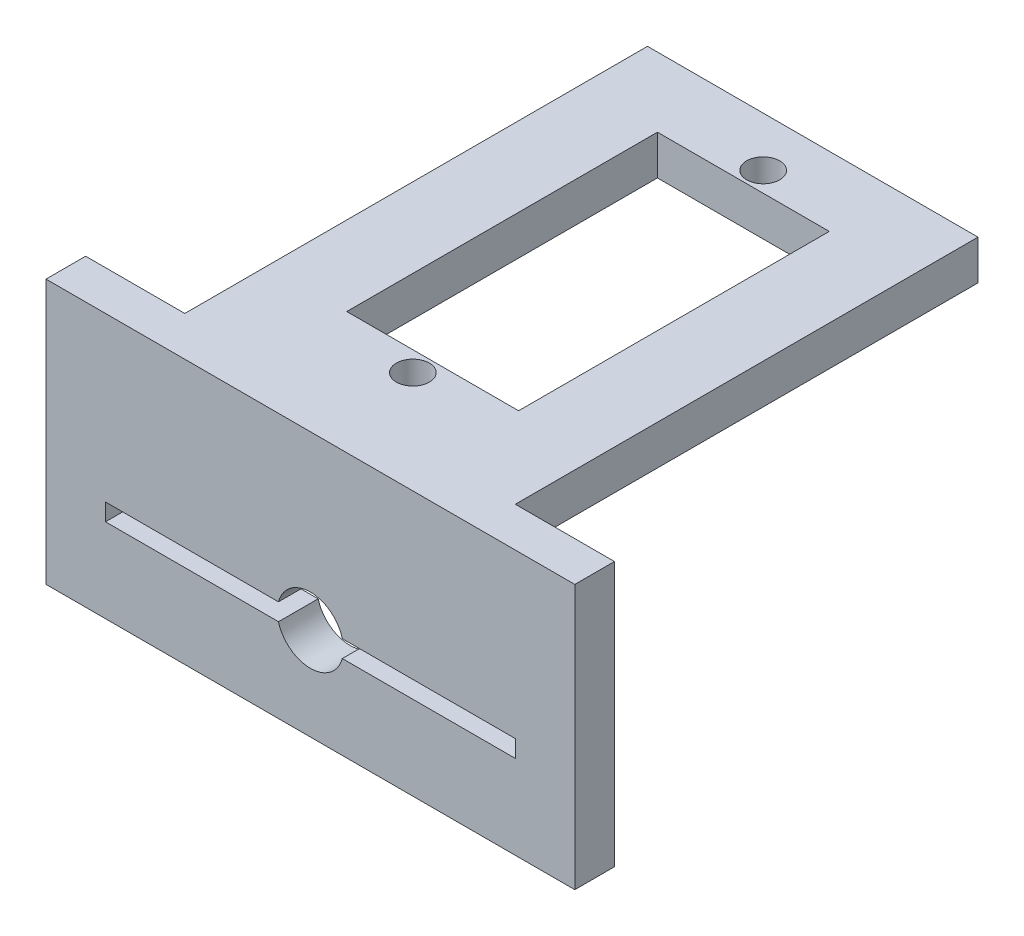
ISO-10303-21;
HEADER;
FILE_DESCRIPTION(('STEP AP214'),'2;1');
FILE_NAME('part.step','',(''),(''),'','','');
FILE_SCHEMA(('AUTOMOTIVE_DESIGN { 1 0 10303 214 1 1 1 1 }'));
ENDSEC;
DATA;
#1=APPLICATION_CONTEXT('core data for automotive mechanical design processes');
#2=APPLICATION_PROTOCOL_DEFINITION('international standard','automotive_design',2000,#1);
#3=PRODUCT_CONTEXT('',#1,'mechanical');
#4=PRODUCT('Part','Part','',(#3));
#5=PRODUCT_RELATED_PRODUCT_CATEGORY('part','',(#4));
#6=PRODUCT_DEFINITION_FORMATION('','',#4);
#7=PRODUCT_DEFINITION_CONTEXT('part definition',#1,'design');
#8=PRODUCT_DEFINITION('design','',#6,#7);
#9=PRODUCT_DEFINITION_SHAPE('','',#8);
#10=(LENGTH_UNIT() NAMED_UNIT(*) SI_UNIT(.MILLI.,.METRE.));
#11=(NAMED_UNIT(*) PLANE_ANGLE_UNIT() SI_UNIT($,.RADIAN.));
#12=(NAMED_UNIT(*) SI_UNIT($,.STERADIAN.) SOLID_ANGLE_UNIT());
#13=UNCERTAINTY_MEASURE_WITH_UNIT(LENGTH_MEASURE(1.E-05),#10,'distance_accuracy_value','');
#14=(GEOMETRIC_REPRESENTATION_CONTEXT(3) GLOBAL_UNCERTAINTY_ASSIGNED_CONTEXT((#13)) GLOBAL_UNIT_ASSIGNED_CONTEXT((#10,
#11,#12)) REPRESENTATION_CONTEXT('',''));
#15=CARTESIAN_POINT('',(0.,0.,0.));
#16=DIRECTION('',(0.,0.,1.));
#17=DIRECTION('',(1.,0.,0.));
#18=AXIS2_PLACEMENT_3D('',#15,#16,#17);
#19=CARTESIAN_POINT('',(0.,0.,-2.));
#20=DIRECTION('',(0.,0.,1.));
#21=DIRECTION('',(-1.,0.,0.));
#22=AXIS2_PLACEMENT_3D('',#19,#20,#21);
#23=PLANE('',#22);
#24=DIRECTION('',(1.,0.,0.));
#25=VECTOR('',#24,1.);
#26=CARTESIAN_POINT('',(15.5,-4.34999999999999,-2.));
#27=LINE('',#26,#25);
#28=CARTESIAN_POINT('',(2.41402154091466,-4.34999999999999,-2.));
#29=VERTEX_POINT('',#28);
#30=CARTESIAN_POINT('',(15.5,-4.34999999999999,-2.));
#31=VERTEX_POINT('',#30);
#32=EDGE_CURVE('E227',#29,#31,#27,.T.);
#33=ORIENTED_EDGE('',*,*,#32,.F.);
#34=CARTESIAN_POINT('',(0.,-4.99999999999999,-2.));
#35=DIRECTION('',(0.,0.,-1.));
#36=DIRECTION('',(-1.,0.,0.));
#37=AXIS2_PLACEMENT_3D('',#34,#35,#36);
#38=CIRCLE('',#37,2.5);
#39=CARTESIAN_POINT('',(-2.41402154091466,-4.34999999999999,-2.));
#40=VERTEX_POINT('',#39);
#41=EDGE_CURVE('E242',#40,#29,#38,.T.);
#42=ORIENTED_EDGE('',*,*,#41,.F.);
#43=DIRECTION('',(1.,0.,0.));
#44=VECTOR('',#43,1.);
#45=CARTESIAN_POINT('',(-2.41402154091466,-4.34999999999999,-2.));
#46=LINE('',#45,#44);
#47=CARTESIAN_POINT('',(-15.5,-4.35,-2.));
#48=VERTEX_POINT('',#47);
#49=EDGE_CURVE('E239',#48,#40,#46,.T.);
#50=ORIENTED_EDGE('',*,*,#49,.F.);
#51=DIRECTION('',(0.,1.,0.));
#52=VECTOR('',#51,1.);
#53=CARTESIAN_POINT('',(-15.5,-4.35,-2.));
#54=LINE('',#53,#52);
#55=CARTESIAN_POINT('',(-15.5,-5.65,-2.));
#56=VERTEX_POINT('',#55);
#57=EDGE_CURVE('E236',#56,#48,#54,.T.);
#58=ORIENTED_EDGE('',*,*,#57,.F.);
#59=DIRECTION('',(-1.,0.,0.));
#60=VECTOR('',#59,1.);
#61=CARTESIAN_POINT('',(-2.41402154091466,-5.64999999999999,-2.));
#62=LINE('',#61,#60);
#63=CARTESIAN_POINT('',(-2.41402154091466,-5.64999999999999,-2.));
#64=VERTEX_POINT('',#63);
#65=EDGE_CURVE('E233',#64,#56,#62,.T.);
#66=ORIENTED_EDGE('',*,*,#65,.F.);
#67=CARTESIAN_POINT('',(0.,-4.99999999999999,-2.));
#68=DIRECTION('',(0.,0.,-1.));
#69=DIRECTION('',(-1.,0.,0.));
#70=AXIS2_PLACEMENT_3D('',#67,#68,#69);
#71=CIRCLE('',#70,2.5);
#72=CARTESIAN_POINT('',(2.41402154091466,-5.64999999999999,-2.));
#73=VERTEX_POINT('',#72);
#74=EDGE_CURVE('E230',#73,#64,#71,.T.);
#75=ORIENTED_EDGE('',*,*,#74,.F.);
#76=DIRECTION('',(-1.,0.,0.));
#77=VECTOR('',#76,1.);
#78=CARTESIAN_POINT('',(15.5,-5.64999999999999,-2.));
#79=LINE('',#78,#77);
#80=CARTESIAN_POINT('',(15.5,-5.64999999999999,-2.));
#81=VERTEX_POINT('',#80);
#82=EDGE_CURVE('E226',#81,#73,#79,.T.);
#83=ORIENTED_EDGE('',*,*,#82,.F.);
#84=DIRECTION('',(0.,-1.,0.));
#85=VECTOR('',#84,1.);
#86=CARTESIAN_POINT('',(15.5,-4.34999999999999,-2.));
#87=LINE('',#86,#85);
#88=EDGE_CURVE('E223',#31,#81,#87,.T.);
#89=ORIENTED_EDGE('',*,*,#88,.F.);
#90=EDGE_LOOP('',(#33,#42,#50,#58,#66,#75,#83,#89));
#91=FACE_BOUND('',#90,.T.);
#92=DIRECTION('',(0.,-1.,0.));
#93=VECTOR('',#92,1.);
#94=CARTESIAN_POINT('',(-12.5,0.,-2.));
#95=LINE('',#94,#93);
#96=CARTESIAN_POINT('',(-12.5,8.00000000000001,-2.));
#97=VERTEX_POINT('',#96);
#98=CARTESIAN_POINT('',(-12.5,5.00000000000001,-2.));
#99=VERTEX_POINT('',#98);
#100=EDGE_CURVE('E11',#97,#99,#95,.T.);
#101=ORIENTED_EDGE('',*,*,#100,.T.);
#102=DIRECTION('',(1.,0.,0.));
#103=VECTOR('',#102,1.);
#104=CARTESIAN_POINT('',(0.,5.00000000000001,-2.));
#105=LINE('',#104,#103);
#106=CARTESIAN_POINT('',(12.5,5.00000000000001,-2.));
#107=VERTEX_POINT('',#106);
#108=EDGE_CURVE('E182',#99,#107,#105,.T.);
#109=ORIENTED_EDGE('',*,*,#108,.T.);
#110=DIRECTION('',(0.,-1.,0.));
#111=VECTOR('',#110,1.);
#112=CARTESIAN_POINT('',(12.5,0.,-2.));
#113=LINE('',#112,#111);
#114=CARTESIAN_POINT('',(12.5,8.00000000000001,-2.));
#115=VERTEX_POINT('',#114);
#116=EDGE_CURVE('E43',#115,#107,#113,.T.);
#117=ORIENTED_EDGE('',*,*,#116,.F.);
#118=DIRECTION('',(-1.,0.,0.));
#119=VECTOR('',#118,1.);
#120=CARTESIAN_POINT('',(-20.,8.00000000000001,-2.));
#121=LINE('',#120,#119);
#122=CARTESIAN_POINT('',(20.,8.00000000000001,-2.));
#123=VERTEX_POINT('',#122);
#124=EDGE_CURVE('E272',#123,#115,#121,.T.);
#125=ORIENTED_EDGE('',*,*,#124,.F.);
#126=DIRECTION('',(0.,1.,0.));
#127=VECTOR('',#126,1.);
#128=CARTESIAN_POINT('',(20.,-12.,-2.));
#129=LINE('',#128,#127);
#130=CARTESIAN_POINT('',(20.,-12.,-2.));
#131=VERTEX_POINT('',#130);
#132=EDGE_CURVE('E268',#131,#123,#129,.T.);
#133=ORIENTED_EDGE('',*,*,#132,.F.);
#134=DIRECTION('',(1.,0.,0.));
#135=VECTOR('',#134,1.);
#136=CARTESIAN_POINT('',(-20.,-12.,-2.));
#137=LINE('',#136,#135);
#138=CARTESIAN_POINT('',(-20.,-12.,-2.));
#139=VERTEX_POINT('',#138);
#140=EDGE_CURVE('E265',#139,#131,#137,.T.);
#141=ORIENTED_EDGE('',*,*,#140,.F.);
#142=DIRECTION('',(0.,-1.,0.));
#143=VECTOR('',#142,1.);
#144=CARTESIAN_POINT('',(-20.,-12.,-2.));
#145=LINE('',#144,#143);
#146=CARTESIAN_POINT('',(-20.,8.00000000000001,-2.));
#147=VERTEX_POINT('',#146);
#148=EDGE_CURVE('E245',#147,#139,#145,.T.);
#149=ORIENTED_EDGE('',*,*,#148,.F.);
#150=EDGE_CURVE('E271',#97,#147,#121,.T.);
#151=ORIENTED_EDGE('',*,*,#150,.F.);
#152=EDGE_LOOP('',(#101,#109,#117,#125,#133,#141,#149,#151));
#153=FACE_BOUND('',#152,.T.);
#154=ADVANCED_FACE('F35',(#91,#153),#23,.F.);
#155=CARTESIAN_POINT('',(0.,-12.,1.));
#156=DIRECTION('',(0.,-1.,0.));
#157=DIRECTION('',(1.,0.,0.));
#158=AXIS2_PLACEMENT_3D('',#155,#156,#157);
#159=PLANE('',#158);
#160=DIRECTION('',(0.,0.,-1.));
#161=VECTOR('',#160,1.);
#162=CARTESIAN_POINT('',(20.,-12.,1.));
#163=LINE('',#162,#161);
#164=CARTESIAN_POINT('',(20.,-12.,1.));
#165=VERTEX_POINT('',#164);
#166=EDGE_CURVE('E286',#165,#131,#163,.T.);
#167=ORIENTED_EDGE('',*,*,#166,.F.);
#168=DIRECTION('',(1.,0.,0.));
#169=VECTOR('',#168,1.);
#170=CARTESIAN_POINT('',(0.,-12.,1.));
#171=LINE('',#170,#169);
#172=CARTESIAN_POINT('',(-20.,-12.,1.));
#173=VERTEX_POINT('',#172);
#174=EDGE_CURVE('E275',#173,#165,#171,.T.);
#175=ORIENTED_EDGE('',*,*,#174,.F.);
#176=DIRECTION('',(0.,0.,-1.));
#177=VECTOR('',#176,1.);
#178=CARTESIAN_POINT('',(-20.,-12.,1.));
#179=LINE('',#178,#177);
#180=EDGE_CURVE('E287',#173,#139,#179,.T.);
#181=ORIENTED_EDGE('',*,*,#180,.T.);
#182=ORIENTED_EDGE('',*,*,#140,.T.);
#183=EDGE_LOOP('',(#167,#175,#181,#182));
#184=FACE_BOUND('',#183,.T.);
#185=ADVANCED_FACE('F37',(#184),#159,.T.);
#186=CARTESIAN_POINT('',(-20.,0.,1.));
#187=DIRECTION('',(1.,0.,0.));
#188=DIRECTION('',(0.,0.,1.));
#189=AXIS2_PLACEMENT_3D('',#186,#187,#188);
#190=PLANE('',#189);
#191=ORIENTED_EDGE('',*,*,#180,.F.);
#192=DIRECTION('',(0.,1.,0.));
#193=VECTOR('',#192,1.);
#194=CARTESIAN_POINT('',(-20.,0.,1.));
#195=LINE('',#194,#193);
#196=CARTESIAN_POINT('',(-20.,8.00000000000001,1.));
#197=VERTEX_POINT('',#196);
#198=EDGE_CURVE('E283',#173,#197,#195,.T.);
#199=ORIENTED_EDGE('',*,*,#198,.T.);
#200=DIRECTION('',(0.,0.,-1.));
#201=VECTOR('',#200,1.);
#202=CARTESIAN_POINT('',(-20.,8.00000000000001,1.));
#203=LINE('',#202,#201);
#204=EDGE_CURVE('E289',#197,#147,#203,.T.);
#205=ORIENTED_EDGE('',*,*,#204,.T.);
#206=ORIENTED_EDGE('',*,*,#148,.T.);
#207=EDGE_LOOP('',(#191,#199,#205,#206));
#208=FACE_BOUND('',#207,.T.);
#209=ADVANCED_FACE('F386',(#208),#190,.F.);
#210=CARTESIAN_POINT('',(0.,8.00000000000001,1.));
#211=DIRECTION('',(0.,-1.,0.));
#212=DIRECTION('',(0.,0.,1.));
#213=AXIS2_PLACEMENT_3D('',#210,#211,#212);
#214=PLANE('',#213);
#215=DIRECTION('',(0.,0.,-1.));
#216=VECTOR('',#215,1.);
#217=CARTESIAN_POINT('',(20.,8.00000000000001,1.));
#218=LINE('',#217,#216);
#219=CARTESIAN_POINT('',(20.,8.00000000000001,1.));
#220=VERTEX_POINT('',#219);
#221=EDGE_CURVE('E291',#220,#123,#218,.T.);
#222=ORIENTED_EDGE('',*,*,#221,.T.);
#223=ORIENTED_EDGE('',*,*,#124,.T.);
#224=DIRECTION('',(0.,0.,1.));
#225=VECTOR('',#224,1.);
#226=CARTESIAN_POINT('',(12.5,8.00000000000001,0.));
#227=LINE('',#226,#225);
#228=CARTESIAN_POINT('',(12.5,8.00000000000001,-37.));
#229=VERTEX_POINT('',#228);
#230=EDGE_CURVE('E298',#229,#115,#227,.T.);
#231=ORIENTED_EDGE('',*,*,#230,.F.);
#232=DIRECTION('',(-1.,0.,0.));
#233=VECTOR('',#232,1.);
#234=CARTESIAN_POINT('',(0.,8.00000000000001,-37.));
#235=LINE('',#234,#233);
#236=CARTESIAN_POINT('',(-12.5,8.00000000000001,-37.));
#237=VERTEX_POINT('',#236);
#238=EDGE_CURVE('E309',#229,#237,#235,.T.);
#239=ORIENTED_EDGE('',*,*,#238,.T.);
#240=DIRECTION('',(0.,0.,1.));
#241=VECTOR('',#240,1.);
#242=CARTESIAN_POINT('',(-12.5,8.00000000000001,0.));
#243=LINE('',#242,#241);
#244=EDGE_CURVE('E186',#237,#97,#243,.T.);
#245=ORIENTED_EDGE('',*,*,#244,.T.);
#246=ORIENTED_EDGE('',*,*,#150,.T.);
#247=ORIENTED_EDGE('',*,*,#204,.F.);
#248=DIRECTION('',(1.,0.,0.));
#249=VECTOR('',#248,1.);
#250=CARTESIAN_POINT('',(0.,8.00000000000001,1.));
#251=LINE('',#250,#249);
#252=EDGE_CURVE('E280',#197,#220,#251,.T.);
#253=ORIENTED_EDGE('',*,*,#252,.T.);
#254=EDGE_LOOP('',(#222,#223,#231,#239,#245,#246,#247,#253));
#255=FACE_BOUND('',#254,.T.);
#256=DIRECTION('',(-1.,0.,0.));
#257=VECTOR('',#256,1.);
#258=CARTESIAN_POINT('',(0.,8.00000000000001,-31.75));
#259=LINE('',#258,#257);
#260=CARTESIAN_POINT('',(6.5,8.00000000000001,-31.75));
#261=VERTEX_POINT('',#260);
#262=CARTESIAN_POINT('',(-6.5,8.00000000000001,-31.75));
#263=VERTEX_POINT('',#262);
#264=EDGE_CURVE('E321',#261,#263,#259,.T.);
#265=ORIENTED_EDGE('',*,*,#264,.F.);
#266=DIRECTION('',(0.,0.,1.));
#267=VECTOR('',#266,1.);
#268=CARTESIAN_POINT('',(6.5,8.00000000000001,0.));
#269=LINE('',#268,#267);
#270=CARTESIAN_POINT('',(6.5,8.00000000000001,-8.25000000000001));
#271=VERTEX_POINT('',#270);
#272=EDGE_CURVE('E183',#261,#271,#269,.T.);
#273=ORIENTED_EDGE('',*,*,#272,.T.);
#274=DIRECTION('',(-1.,0.,0.));
#275=VECTOR('',#274,1.);
#276=CARTESIAN_POINT('',(0.,8.00000000000001,-8.25000000000001));
#277=LINE('',#276,#275);
#278=CARTESIAN_POINT('',(-6.5,8.00000000000001,-8.25000000000001));
#279=VERTEX_POINT('',#278);
#280=EDGE_CURVE('E327',#271,#279,#277,.T.);
#281=ORIENTED_EDGE('',*,*,#280,.T.);
#282=DIRECTION('',(0.,0.,1.));
#283=VECTOR('',#282,1.);
#284=CARTESIAN_POINT('',(-6.5,8.00000000000001,0.));
#285=LINE('',#284,#283);
#286=EDGE_CURVE('E324',#263,#279,#285,.T.);
#287=ORIENTED_EDGE('',*,*,#286,.F.);
#288=EDGE_LOOP('',(#265,#273,#281,#287));
#289=FACE_BOUND('',#288,.T.);
#290=CARTESIAN_POINT('',(0.,8.00000000000001,-6.75000000000001));
#291=DIRECTION('',(0.,-1.,0.));
#292=DIRECTION('',(-1.,0.,0.));
#293=AXIS2_PLACEMENT_3D('',#290,#291,#292);
#294=CIRCLE('',#293,1.25);
#295=CARTESIAN_POINT('',(-1.25,8.00000000000001,-6.75000000000001));
#296=VERTEX_POINT('',#295);
#297=EDGE_CURVE('E318',#296,#296,#294,.T.);
#298=ORIENTED_EDGE('',*,*,#297,.T.);
#299=EDGE_LOOP('',(#298));
#300=FACE_BOUND('',#299,.T.);
#301=CARTESIAN_POINT('',(0.,8.00000000000001,-33.25));
#302=DIRECTION('',(0.,-1.,0.));
#303=DIRECTION('',(-1.,0.,0.));
#304=AXIS2_PLACEMENT_3D('',#301,#302,#303);
#305=CIRCLE('',#304,1.25);
#306=CARTESIAN_POINT('',(-1.25,8.00000000000001,-33.25));
#307=VERTEX_POINT('',#306);
#308=EDGE_CURVE('E315',#307,#307,#305,.T.);
#309=ORIENTED_EDGE('',*,*,#308,.T.);
#310=EDGE_LOOP('',(#309));
#311=FACE_BOUND('',#310,.T.);
#312=ADVANCED_FACE('F307',(#255,#289,#300,#311),#214,.F.);
#313=CARTESIAN_POINT('',(20.,0.,1.));
#314=DIRECTION('',(1.,0.,0.));
#315=DIRECTION('',(0.,1.,0.));
#316=AXIS2_PLACEMENT_3D('',#313,#314,#315);
#317=PLANE('',#316);
#318=ORIENTED_EDGE('',*,*,#221,.F.);
#319=DIRECTION('',(0.,1.,0.));
#320=VECTOR('',#319,1.);
#321=CARTESIAN_POINT('',(20.,0.,1.));
#322=LINE('',#321,#320);
#323=EDGE_CURVE('E278',#165,#220,#322,.T.);
#324=ORIENTED_EDGE('',*,*,#323,.F.);
#325=ORIENTED_EDGE('',*,*,#166,.T.);
#326=ORIENTED_EDGE('',*,*,#132,.T.);
#327=EDGE_LOOP('',(#318,#324,#325,#326));
#328=FACE_BOUND('',#327,.T.);
#329=ADVANCED_FACE('F385',(#328),#317,.T.);
#330=CARTESIAN_POINT('',(0.,0.,1.));
#331=DIRECTION('',(0.,0.,-1.));
#332=DIRECTION('',(1.,0.,0.));
#333=AXIS2_PLACEMENT_3D('',#330,#331,#332);
#334=PLANE('',#333);
#335=ORIENTED_EDGE('',*,*,#252,.F.);
#336=ORIENTED_EDGE('',*,*,#198,.F.);
#337=ORIENTED_EDGE('',*,*,#174,.T.);
#338=ORIENTED_EDGE('',*,*,#323,.T.);
#339=EDGE_LOOP('',(#335,#336,#337,#338));
#340=FACE_BOUND('',#339,.T.);
#341=DIRECTION('',(1.,0.,0.));
#342=VECTOR('',#341,1.);
#343=CARTESIAN_POINT('',(15.5,-4.34999999999999,1.));
#344=LINE('',#343,#342);
#345=CARTESIAN_POINT('',(2.41402154091466,-4.34999999999999,1.));
#346=VERTEX_POINT('',#345);
#347=CARTESIAN_POINT('',(15.5,-4.34999999999999,1.));
#348=VERTEX_POINT('',#347);
#349=EDGE_CURVE('E213',#346,#348,#344,.T.);
#350=ORIENTED_EDGE('',*,*,#349,.T.);
#351=DIRECTION('',(0.,-1.,0.));
#352=VECTOR('',#351,1.);
#353=CARTESIAN_POINT('',(15.5,-4.34999999999999,1.));
#354=LINE('',#353,#352);
#355=CARTESIAN_POINT('',(15.5,-5.64999999999999,1.));
#356=VERTEX_POINT('',#355);
#357=EDGE_CURVE('E210',#348,#356,#354,.T.);
#358=ORIENTED_EDGE('',*,*,#357,.T.);
#359=DIRECTION('',(-1.,0.,0.));
#360=VECTOR('',#359,1.);
#361=CARTESIAN_POINT('',(15.5,-5.64999999999999,1.));
#362=LINE('',#361,#360);
#363=CARTESIAN_POINT('',(2.41402154091466,-5.64999999999999,1.));
#364=VERTEX_POINT('',#363);
#365=EDGE_CURVE('E207',#356,#364,#362,.T.);
#366=ORIENTED_EDGE('',*,*,#365,.T.);
#367=CARTESIAN_POINT('',(0.,-4.99999999999999,1.));
#368=DIRECTION('',(0.,0.,1.));
#369=DIRECTION('',(1.,0.,0.));
#370=AXIS2_PLACEMENT_3D('',#367,#368,#369);
#371=CIRCLE('',#370,2.5);
#372=CARTESIAN_POINT('',(-2.41402154091466,-5.64999999999999,1.));
#373=VERTEX_POINT('',#372);
#374=EDGE_CURVE('E204',#364,#373,#371,.F.);
#375=ORIENTED_EDGE('',*,*,#374,.T.);
#376=DIRECTION('',(-1.,0.,0.));
#377=VECTOR('',#376,1.);
#378=CARTESIAN_POINT('',(-2.41402154091466,-5.64999999999999,1.));
#379=LINE('',#378,#377);
#380=CARTESIAN_POINT('',(-15.5,-5.65,1.));
#381=VERTEX_POINT('',#380);
#382=EDGE_CURVE('E200',#373,#381,#379,.T.);
#383=ORIENTED_EDGE('',*,*,#382,.T.);
#384=DIRECTION('',(0.,1.,0.));
#385=VECTOR('',#384,1.);
#386=CARTESIAN_POINT('',(-15.5,-4.35,1.));
#387=LINE('',#386,#385);
#388=CARTESIAN_POINT('',(-15.5,-4.35,1.));
#389=VERTEX_POINT('',#388);
#390=EDGE_CURVE('E197',#381,#389,#387,.T.);
#391=ORIENTED_EDGE('',*,*,#390,.T.);
#392=DIRECTION('',(1.,0.,0.));
#393=VECTOR('',#392,1.);
#394=CARTESIAN_POINT('',(-2.41402154091466,-4.34999999999999,1.));
#395=LINE('',#394,#393);
#396=CARTESIAN_POINT('',(-2.41402154091466,-4.34999999999999,1.));
#397=VERTEX_POINT('',#396);
#398=EDGE_CURVE('E219',#389,#397,#395,.T.);
#399=ORIENTED_EDGE('',*,*,#398,.T.);
#400=CARTESIAN_POINT('',(0.,-4.99999999999999,1.));
#401=DIRECTION('',(0.,0.,1.));
#402=DIRECTION('',(1.,0.,0.));
#403=AXIS2_PLACEMENT_3D('',#400,#401,#402);
#404=CIRCLE('',#403,2.5);
#405=EDGE_CURVE('E216',#397,#346,#404,.F.);
#406=ORIENTED_EDGE('',*,*,#405,.T.);
#407=EDGE_LOOP('',(#350,#358,#366,#375,#383,#391,#399,#406));
#408=FACE_BOUND('',#407,.T.);
#409=ADVANCED_FACE('F408',(#340,#408),#334,.F.);
#410=CARTESIAN_POINT('',(15.5,-4.34999999999999,-33.4006369362152));
#411=DIRECTION('',(0.,-1.,0.));
#412=DIRECTION('',(1.,0.,0.));
#413=AXIS2_PLACEMENT_3D('',#410,#411,#412);
#414=PLANE('',#413);
#415=DIRECTION('',(0.,0.,1.));
#416=VECTOR('',#415,1.);
#417=CARTESIAN_POINT('',(2.41402154091466,-4.34999999999999,-33.4006369362152));
#418=LINE('',#417,#416);
#419=EDGE_CURVE('E222',#29,#346,#418,.T.);
#420=ORIENTED_EDGE('',*,*,#419,.F.);
#421=ORIENTED_EDGE('',*,*,#32,.T.);
#422=DIRECTION('',(0.,0.,1.));
#423=VECTOR('',#422,1.);
#424=CARTESIAN_POINT('',(15.5,-4.34999999999999,-33.4006369362152));
#425=LINE('',#424,#423);
#426=EDGE_CURVE('E247',#31,#348,#425,.T.);
#427=ORIENTED_EDGE('',*,*,#426,.T.);
#428=ORIENTED_EDGE('',*,*,#349,.F.);
#429=EDGE_LOOP('',(#420,#421,#427,#428));
#430=FACE_BOUND('',#429,.T.);
#431=ADVANCED_FACE('F411',(#430),#414,.T.);
#432=CARTESIAN_POINT('',(15.5,-4.34999999999999,-33.4006369362152));
#433=DIRECTION('',(-1.,0.,0.));
#434=DIRECTION('',(0.,0.,-1.));
#435=AXIS2_PLACEMENT_3D('',#432,#433,#434);
#436=PLANE('',#435);
#437=ORIENTED_EDGE('',*,*,#426,.F.);
#438=ORIENTED_EDGE('',*,*,#88,.T.);
#439=DIRECTION('',(0.,0.,1.));
#440=VECTOR('',#439,1.);
#441=CARTESIAN_POINT('',(15.5,-5.64999999999999,-33.4006369362152));
#442=LINE('',#441,#440);
#443=EDGE_CURVE('E249',#81,#356,#442,.T.);
#444=ORIENTED_EDGE('',*,*,#443,.T.);
#445=ORIENTED_EDGE('',*,*,#357,.F.);
#446=EDGE_LOOP('',(#437,#438,#444,#445));
#447=FACE_BOUND('',#446,.T.);
#448=ADVANCED_FACE('F431',(#447),#436,.T.);
#449=CARTESIAN_POINT('',(15.5,-5.64999999999999,-33.4006369362152));
#450=DIRECTION('',(0.,1.,0.));
#451=DIRECTION('',(-1.,0.,0.));
#452=AXIS2_PLACEMENT_3D('',#449,#450,#451);
#453=PLANE('',#452);
#454=ORIENTED_EDGE('',*,*,#443,.F.);
#455=ORIENTED_EDGE('',*,*,#82,.T.);
#456=DIRECTION('',(0.,0.,1.));
#457=VECTOR('',#456,1.);
#458=CARTESIAN_POINT('',(2.41402154091466,-5.64999999999999,-33.4006369362152));
#459=LINE('',#458,#457);
#460=EDGE_CURVE('E251',#73,#364,#459,.T.);
#461=ORIENTED_EDGE('',*,*,#460,.T.);
#462=ORIENTED_EDGE('',*,*,#365,.F.);
#463=EDGE_LOOP('',(#454,#455,#461,#462));
#464=FACE_BOUND('',#463,.T.);
#465=ADVANCED_FACE('F435',(#464),#453,.T.);
#466=CARTESIAN_POINT('',(0.,-4.99999999999999,-33.4006369362152));
#467=DIRECTION('',(0.,0.,1.));
#468=DIRECTION('',(-1.,0.,0.));
#469=AXIS2_PLACEMENT_3D('',#466,#467,#468);
#470=CYLINDRICAL_SURFACE('',#469,2.5);
#471=ORIENTED_EDGE('',*,*,#460,.F.);
#472=ORIENTED_EDGE('',*,*,#74,.T.);
#473=DIRECTION('',(0.,0.,1.));
#474=VECTOR('',#473,1.);
#475=CARTESIAN_POINT('',(-2.41402154091466,-5.64999999999999,-33.4006369362152));
#476=LINE('',#475,#474);
#477=EDGE_CURVE('E253',#64,#373,#476,.T.);
#478=ORIENTED_EDGE('',*,*,#477,.T.);
#479=ORIENTED_EDGE('',*,*,#374,.F.);
#480=EDGE_LOOP('',(#471,#472,#478,#479));
#481=FACE_BOUND('',#480,.T.);
#482=ADVANCED_FACE('F439',(#481),#470,.F.);
#483=CARTESIAN_POINT('',(-2.41402154091466,-5.64999999999999,-33.4006369362152));
#484=DIRECTION('',(0.,1.,0.));
#485=DIRECTION('',(-1.,0.,0.));
#486=AXIS2_PLACEMENT_3D('',#483,#484,#485);
#487=PLANE('',#486);
#488=ORIENTED_EDGE('',*,*,#477,.F.);
#489=ORIENTED_EDGE('',*,*,#65,.T.);
#490=DIRECTION('',(0.,0.,1.));
#491=VECTOR('',#490,1.);
#492=CARTESIAN_POINT('',(-15.5,-5.65,-33.4006369362152));
#493=LINE('',#492,#491);
#494=EDGE_CURVE('E255',#56,#381,#493,.T.);
#495=ORIENTED_EDGE('',*,*,#494,.T.);
#496=ORIENTED_EDGE('',*,*,#382,.F.);
#497=EDGE_LOOP('',(#488,#489,#495,#496));
#498=FACE_BOUND('',#497,.T.);
#499=ADVANCED_FACE('F443',(#498),#487,.T.);
#500=CARTESIAN_POINT('',(-15.5,-4.35,-33.4006369362152));
#501=DIRECTION('',(1.,0.,0.));
#502=DIRECTION('',(0.,0.,1.));
#503=AXIS2_PLACEMENT_3D('',#500,#501,#502);
#504=PLANE('',#503);
#505=ORIENTED_EDGE('',*,*,#494,.F.);
#506=ORIENTED_EDGE('',*,*,#57,.T.);
#507=DIRECTION('',(0.,0.,1.));
#508=VECTOR('',#507,1.);
#509=CARTESIAN_POINT('',(-15.5,-4.35,-33.4006369362152));
#510=LINE('',#509,#508);
#511=EDGE_CURVE('E257',#48,#389,#510,.T.);
#512=ORIENTED_EDGE('',*,*,#511,.T.);
#513=ORIENTED_EDGE('',*,*,#390,.F.);
#514=EDGE_LOOP('',(#505,#506,#512,#513));
#515=FACE_BOUND('',#514,.T.);
#516=ADVANCED_FACE('F447',(#515),#504,.T.);
#517=CARTESIAN_POINT('',(-2.41402154091466,-4.34999999999999,-33.4006369362152));
#518=DIRECTION('',(0.,-1.,0.));
#519=DIRECTION('',(1.,0.,0.));
#520=AXIS2_PLACEMENT_3D('',#517,#518,#519);
#521=PLANE('',#520);
#522=ORIENTED_EDGE('',*,*,#511,.F.);
#523=ORIENTED_EDGE('',*,*,#49,.T.);
#524=DIRECTION('',(0.,0.,1.));
#525=VECTOR('',#524,1.);
#526=CARTESIAN_POINT('',(-2.41402154091466,-4.34999999999999,-33.4006369362152));
#527=LINE('',#526,#525);
#528=EDGE_CURVE('E259',#40,#397,#527,.T.);
#529=ORIENTED_EDGE('',*,*,#528,.T.);
#530=ORIENTED_EDGE('',*,*,#398,.F.);
#531=EDGE_LOOP('',(#522,#523,#529,#530));
#532=FACE_BOUND('',#531,.T.);
#533=ADVANCED_FACE('F450',(#532),#521,.T.);
#534=CARTESIAN_POINT('',(0.,-4.99999999999999,-33.4006369362152));
#535=DIRECTION('',(0.,0.,1.));
#536=DIRECTION('',(-1.,0.,0.));
#537=AXIS2_PLACEMENT_3D('',#534,#535,#536);
#538=CYLINDRICAL_SURFACE('',#537,2.5);
#539=ORIENTED_EDGE('',*,*,#528,.F.);
#540=ORIENTED_EDGE('',*,*,#41,.T.);
#541=ORIENTED_EDGE('',*,*,#419,.T.);
#542=ORIENTED_EDGE('',*,*,#405,.F.);
#543=EDGE_LOOP('',(#539,#540,#541,#542));
#544=FACE_BOUND('',#543,.T.);
#545=ADVANCED_FACE('F406',(#544),#538,.F.);
#546=CARTESIAN_POINT('',(-12.5,5.00000000000001,0.));
#547=DIRECTION('',(1.,0.,0.));
#548=DIRECTION('',(0.,1.,0.));
#549=AXIS2_PLACEMENT_3D('',#546,#547,#548);
#550=PLANE('',#549);
#551=ORIENTED_EDGE('',*,*,#244,.F.);
#552=DIRECTION('',(0.,1.,0.));
#553=VECTOR('',#552,1.);
#554=CARTESIAN_POINT('',(-12.5,5.00000000000001,-37.));
#555=LINE('',#554,#553);
#556=CARTESIAN_POINT('',(-12.5,5.00000000000001,-37.));
#557=VERTEX_POINT('',#556);
#558=EDGE_CURVE('E176',#557,#237,#555,.T.);
#559=ORIENTED_EDGE('',*,*,#558,.F.);
#560=DIRECTION('',(0.,0.,1.));
#561=VECTOR('',#560,1.);
#562=CARTESIAN_POINT('',(-12.5,5.00000000000001,0.));
#563=LINE('',#562,#561);
#564=EDGE_CURVE('E58',#557,#99,#563,.T.);
#565=ORIENTED_EDGE('',*,*,#564,.T.);
#566=ORIENTED_EDGE('',*,*,#100,.F.);
#567=EDGE_LOOP('',(#551,#559,#565,#566));
#568=FACE_BOUND('',#567,.T.);
#569=ADVANCED_FACE('F185',(#568),#550,.F.);
#570=CARTESIAN_POINT('',(12.5,5.00000000000001,0.));
#571=DIRECTION('',(1.,0.,0.));
#572=DIRECTION('',(0.,1.,0.));
#573=AXIS2_PLACEMENT_3D('',#570,#571,#572);
#574=PLANE('',#573);
#575=ORIENTED_EDGE('',*,*,#116,.T.);
#576=DIRECTION('',(0.,0.,1.));
#577=VECTOR('',#576,1.);
#578=CARTESIAN_POINT('',(12.5,5.00000000000001,0.));
#579=LINE('',#578,#577);
#580=CARTESIAN_POINT('',(12.5,5.00000000000001,-37.));
#581=VERTEX_POINT('',#580);
#582=EDGE_CURVE('E50',#581,#107,#579,.T.);
#583=ORIENTED_EDGE('',*,*,#582,.F.);
#584=DIRECTION('',(0.,1.,0.));
#585=VECTOR('',#584,1.);
#586=CARTESIAN_POINT('',(12.5,5.00000000000001,-37.));
#587=LINE('',#586,#585);
#588=EDGE_CURVE('E178',#581,#229,#587,.T.);
#589=ORIENTED_EDGE('',*,*,#588,.T.);
#590=ORIENTED_EDGE('',*,*,#230,.T.);
#591=EDGE_LOOP('',(#575,#583,#589,#590));
#592=FACE_BOUND('',#591,.T.);
#593=ADVANCED_FACE('F296',(#592),#574,.T.);
#594=CARTESIAN_POINT('',(0.,5.00000000000001,0.));
#595=DIRECTION('',(0.,1.,0.));
#596=DIRECTION('',(-1.,0.,0.));
#597=AXIS2_PLACEMENT_3D('',#594,#595,#596);
#598=PLANE('',#597);
#599=CARTESIAN_POINT('',(0.,5.00000000000001,-33.25));
#600=DIRECTION('',(0.,-1.,0.));
#601=DIRECTION('',(-1.,0.,0.));
#602=AXIS2_PLACEMENT_3D('',#599,#600,#601);
#603=CIRCLE('',#602,1.25);
#604=CARTESIAN_POINT('',(-1.25,5.00000000000001,-33.25));
#605=VERTEX_POINT('',#604);
#606=EDGE_CURVE('E365',#605,#605,#603,.T.);
#607=ORIENTED_EDGE('',*,*,#606,.F.);
#608=EDGE_LOOP('',(#607));
#609=FACE_BOUND('',#608,.T.);
#610=CARTESIAN_POINT('',(0.,5.00000000000001,-6.75000000000001));
#611=DIRECTION('',(0.,-1.,0.));
#612=DIRECTION('',(-1.,0.,0.));
#613=AXIS2_PLACEMENT_3D('',#610,#611,#612);
#614=CIRCLE('',#613,1.25);
#615=CARTESIAN_POINT('',(-1.25,5.00000000000001,-6.75000000000001));
#616=VERTEX_POINT('',#615);
#617=EDGE_CURVE('E360',#616,#616,#614,.T.);
#618=ORIENTED_EDGE('',*,*,#617,.F.);
#619=EDGE_LOOP('',(#618));
#620=FACE_BOUND('',#619,.T.);
#621=DIRECTION('',(-1.,0.,0.));
#622=VECTOR('',#621,1.);
#623=CARTESIAN_POINT('',(0.,5.00000000000001,-31.75));
#624=LINE('',#623,#622);
#625=CARTESIAN_POINT('',(6.5,5.00000000000001,-31.75));
#626=VERTEX_POINT('',#625);
#627=CARTESIAN_POINT('',(-6.5,5.00000000000001,-31.75));
#628=VERTEX_POINT('',#627);
#629=EDGE_CURVE('E350',#626,#628,#624,.T.);
#630=ORIENTED_EDGE('',*,*,#629,.T.);
#631=DIRECTION('',(0.,0.,1.));
#632=VECTOR('',#631,1.);
#633=CARTESIAN_POINT('',(-6.5,5.00000000000001,0.));
#634=LINE('',#633,#632);
#635=CARTESIAN_POINT('',(-6.5,5.00000000000001,-8.25000000000001));
#636=VERTEX_POINT('',#635);
#637=EDGE_CURVE('E341',#628,#636,#634,.T.);
#638=ORIENTED_EDGE('',*,*,#637,.T.);
#639=DIRECTION('',(-1.,0.,0.));
#640=VECTOR('',#639,1.);
#641=CARTESIAN_POINT('',(0.,5.00000000000001,-8.25000000000001));
#642=LINE('',#641,#640);
#643=CARTESIAN_POINT('',(6.5,5.00000000000001,-8.25000000000001));
#644=VERTEX_POINT('',#643);
#645=EDGE_CURVE('E193',#644,#636,#642,.T.);
#646=ORIENTED_EDGE('',*,*,#645,.F.);
#647=DIRECTION('',(0.,0.,1.));
#648=VECTOR('',#647,1.);
#649=CARTESIAN_POINT('',(6.5,5.00000000000001,0.));
#650=LINE('',#649,#648);
#651=EDGE_CURVE('E188',#626,#644,#650,.T.);
#652=ORIENTED_EDGE('',*,*,#651,.F.);
#653=EDGE_LOOP('',(#630,#638,#646,#652));
#654=FACE_BOUND('',#653,.T.);
#655=ORIENTED_EDGE('',*,*,#564,.F.);
#656=DIRECTION('',(-1.,0.,0.));
#657=VECTOR('',#656,1.);
#658=CARTESIAN_POINT('',(0.,5.00000000000001,-37.));
#659=LINE('',#658,#657);
#660=EDGE_CURVE('E173',#581,#557,#659,.T.);
#661=ORIENTED_EDGE('',*,*,#660,.F.);
#662=ORIENTED_EDGE('',*,*,#582,.T.);
#663=ORIENTED_EDGE('',*,*,#108,.F.);
#664=EDGE_LOOP('',(#655,#661,#662,#663));
#665=FACE_BOUND('',#664,.T.);
#666=ADVANCED_FACE('F180',(#609,#620,#654,#665),#598,.F.);
#667=CARTESIAN_POINT('',(0.,5.00000000000001,-31.75));
#668=DIRECTION('',(0.,0.,1.));
#669=DIRECTION('',(-1.,0.,0.));
#670=AXIS2_PLACEMENT_3D('',#667,#668,#669);
#671=PLANE('',#670);
#672=ORIENTED_EDGE('',*,*,#264,.T.);
#673=DIRECTION('',(0.,1.,0.));
#674=VECTOR('',#673,1.);
#675=CARTESIAN_POINT('',(-6.5,5.00000000000001,-31.75));
#676=LINE('',#675,#674);
#677=EDGE_CURVE('E190',#628,#263,#676,.T.);
#678=ORIENTED_EDGE('',*,*,#677,.F.);
#679=ORIENTED_EDGE('',*,*,#629,.F.);
#680=DIRECTION('',(0.,1.,0.));
#681=VECTOR('',#680,1.);
#682=CARTESIAN_POINT('',(6.5,5.00000000000001,-31.75));
#683=LINE('',#682,#681);
#684=EDGE_CURVE('E201',#626,#261,#683,.T.);
#685=ORIENTED_EDGE('',*,*,#684,.T.);
#686=EDGE_LOOP('',(#672,#678,#679,#685));
#687=FACE_BOUND('',#686,.T.);
#688=ADVANCED_FACE('F348',(#687),#671,.T.);
#689=CARTESIAN_POINT('',(6.5,5.00000000000001,0.));
#690=DIRECTION('',(1.,0.,0.));
#691=DIRECTION('',(0.,1.,0.));
#692=AXIS2_PLACEMENT_3D('',#689,#690,#691);
#693=PLANE('',#692);
#694=ORIENTED_EDGE('',*,*,#272,.F.);
#695=ORIENTED_EDGE('',*,*,#684,.F.);
#696=ORIENTED_EDGE('',*,*,#651,.T.);
#697=DIRECTION('',(0.,1.,0.));
#698=VECTOR('',#697,1.);
#699=CARTESIAN_POINT('',(6.5,5.00000000000001,-8.25000000000001));
#700=LINE('',#699,#698);
#701=EDGE_CURVE('E333',#644,#271,#700,.T.);
#702=ORIENTED_EDGE('',*,*,#701,.T.);
#703=EDGE_LOOP('',(#694,#695,#696,#702));
#704=FACE_BOUND('',#703,.T.);
#705=ADVANCED_FACE('F353',(#704),#693,.F.);
#706=CARTESIAN_POINT('',(0.,5.00000000000001,-8.25000000000001));
#707=DIRECTION('',(0.,0.,1.));
#708=DIRECTION('',(-1.,0.,0.));
#709=AXIS2_PLACEMENT_3D('',#706,#707,#708);
#710=PLANE('',#709);
#711=ORIENTED_EDGE('',*,*,#280,.F.);
#712=ORIENTED_EDGE('',*,*,#701,.F.);
#713=ORIENTED_EDGE('',*,*,#645,.T.);
#714=DIRECTION('',(0.,1.,0.));
#715=VECTOR('',#714,1.);
#716=CARTESIAN_POINT('',(-6.5,5.00000000000001,-8.25000000000001));
#717=LINE('',#716,#715);
#718=EDGE_CURVE('E335',#636,#279,#717,.T.);
#719=ORIENTED_EDGE('',*,*,#718,.T.);
#720=EDGE_LOOP('',(#711,#712,#713,#719));
#721=FACE_BOUND('',#720,.T.);
#722=ADVANCED_FACE('F357',(#721),#710,.F.);
#723=CARTESIAN_POINT('',(0.,5.00000000000001,-6.75000000000001));
#724=DIRECTION('',(0.,1.,0.));
#725=DIRECTION('',(-1.,0.,0.));
#726=AXIS2_PLACEMENT_3D('',#723,#724,#725);
#727=CYLINDRICAL_SURFACE('',#726,1.25);
#728=ORIENTED_EDGE('',*,*,#617,.T.);
#729=EDGE_LOOP('',(#728));
#730=FACE_BOUND('',#729,.T.);
#731=ORIENTED_EDGE('',*,*,#297,.F.);
#732=EDGE_LOOP('',(#731));
#733=FACE_BOUND('',#732,.T.);
#734=ADVANCED_FACE('F378',(#730,#733),#727,.F.);
#735=CARTESIAN_POINT('',(0.,5.00000000000001,-33.25));
#736=DIRECTION('',(0.,1.,0.));
#737=DIRECTION('',(-1.,0.,0.));
#738=AXIS2_PLACEMENT_3D('',#735,#736,#737);
#739=CYLINDRICAL_SURFACE('',#738,1.25);
#740=ORIENTED_EDGE('',*,*,#606,.T.);
#741=EDGE_LOOP('',(#740));
#742=FACE_BOUND('',#741,.T.);
#743=ORIENTED_EDGE('',*,*,#308,.F.);
#744=EDGE_LOOP('',(#743));
#745=FACE_BOUND('',#744,.T.);
#746=ADVANCED_FACE('F370',(#742,#745),#739,.F.);
#747=CARTESIAN_POINT('',(0.,5.00000000000001,-37.));
#748=DIRECTION('',(0.,0.,1.));
#749=DIRECTION('',(-1.,0.,0.));
#750=AXIS2_PLACEMENT_3D('',#747,#748,#749);
#751=PLANE('',#750);
#752=ORIENTED_EDGE('',*,*,#238,.F.);
#753=ORIENTED_EDGE('',*,*,#588,.F.);
#754=ORIENTED_EDGE('',*,*,#660,.T.);
#755=ORIENTED_EDGE('',*,*,#558,.T.);
#756=EDGE_LOOP('',(#752,#753,#754,#755));
#757=FACE_BOUND('',#756,.T.);
#758=ADVANCED_FACE('F175',(#757),#751,.F.);
#759=CARTESIAN_POINT('',(-6.5,5.00000000000001,0.));
#760=DIRECTION('',(1.,0.,0.));
#761=DIRECTION('',(0.,1.,0.));
#762=AXIS2_PLACEMENT_3D('',#759,#760,#761);
#763=PLANE('',#762);
#764=ORIENTED_EDGE('',*,*,#286,.T.);
#765=ORIENTED_EDGE('',*,*,#718,.F.);
#766=ORIENTED_EDGE('',*,*,#637,.F.);
#767=ORIENTED_EDGE('',*,*,#677,.T.);
#768=EDGE_LOOP('',(#764,#765,#766,#767));
#769=FACE_BOUND('',#768,.T.);
#770=ADVANCED_FACE('F339',(#769),#763,.T.);
#771=CLOSED_SHELL('',(#154,#185,#209,#312,#329,#409,#431,#448,#465,#482,#499,#516,#533,#545,
#569,#593,#666,#688,#705,#722,#734,#746,#758,#770));
#772=MANIFOLD_SOLID_BREP('B2',#771);
#773=ADVANCED_BREP_SHAPE_REPRESENTATION('',(#18,#772),#14);
#774=SHAPE_DEFINITION_REPRESENTATION(#9,#773);
ENDSEC;
END-ISO-10303-21;
